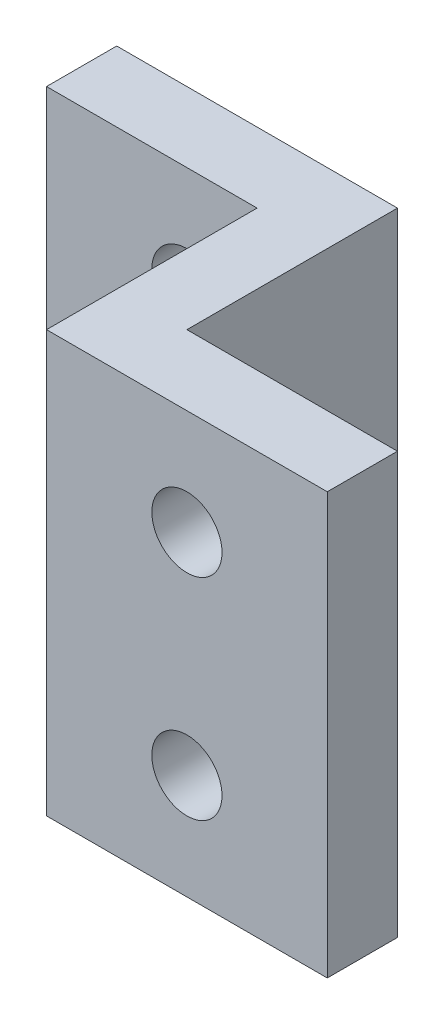
ISO-10303-21;
HEADER;
FILE_DESCRIPTION(('STEP AP214'),'2;1');
FILE_NAME('part.step','',(''),(''),'','','');
FILE_SCHEMA(('AUTOMOTIVE_DESIGN { 1 0 10303 214 1 1 1 1 }'));
ENDSEC;
DATA;
#1=APPLICATION_CONTEXT('core data for automotive mechanical design processes');
#2=APPLICATION_PROTOCOL_DEFINITION('international standard','automotive_design',2000,#1);
#3=PRODUCT_CONTEXT('',#1,'mechanical');
#4=PRODUCT('Part','Part','',(#3));
#5=PRODUCT_RELATED_PRODUCT_CATEGORY('part','',(#4));
#6=PRODUCT_DEFINITION_FORMATION('','',#4);
#7=PRODUCT_DEFINITION_CONTEXT('part definition',#1,'design');
#8=PRODUCT_DEFINITION('design','',#6,#7);
#9=PRODUCT_DEFINITION_SHAPE('','',#8);
#10=(LENGTH_UNIT() NAMED_UNIT(*) SI_UNIT(.MILLI.,.METRE.));
#11=(NAMED_UNIT(*) PLANE_ANGLE_UNIT() SI_UNIT($,.RADIAN.));
#12=(NAMED_UNIT(*) SI_UNIT($,.STERADIAN.) SOLID_ANGLE_UNIT());
#13=UNCERTAINTY_MEASURE_WITH_UNIT(LENGTH_MEASURE(1.E-05),#10,'distance_accuracy_value','');
#14=(GEOMETRIC_REPRESENTATION_CONTEXT(3) GLOBAL_UNCERTAINTY_ASSIGNED_CONTEXT((#13)) GLOBAL_UNIT_ASSIGNED_CONTEXT((#10,
#11,#12)) REPRESENTATION_CONTEXT('',''));
#15=CARTESIAN_POINT('',(0.,0.,0.));
#16=DIRECTION('',(0.,0.,1.));
#17=DIRECTION('',(1.,0.,0.));
#18=AXIS2_PLACEMENT_3D('',#15,#16,#17);
#19=CARTESIAN_POINT('',(-41.1927693778549,21.7251632935657,5.));
#20=DIRECTION('',(-1.,0.,0.));
#21=DIRECTION('',(0.,-1.,0.));
#22=AXIS2_PLACEMENT_3D('',#19,#20,#21);
#23=PLANE('',#22);
#24=DIRECTION('',(0.,0.,-1.));
#25=VECTOR('',#24,1.);
#26=CARTESIAN_POINT('',(-41.1927693778549,21.7251632935657,5.));
#27=LINE('',#26,#25);
#28=CARTESIAN_POINT('',(-41.1927693778549,21.7251632935657,5.));
#29=VERTEX_POINT('',#28);
#30=CARTESIAN_POINT('',(-41.1927693778549,21.7251632935657,-10.));
#31=VERTEX_POINT('',#30);
#32=EDGE_CURVE('E180',#29,#31,#27,.T.);
#33=ORIENTED_EDGE('',*,*,#32,.T.);
#34=DIRECTION('',(0.,-1.,0.));
#35=VECTOR('',#34,1.);
#36=CARTESIAN_POINT('',(-41.1927693778549,-8.27483670643432,-10.));
#37=LINE('',#36,#35);
#38=CARTESIAN_POINT('',(-41.1927693778549,-8.27483670643432,-10.));
#39=VERTEX_POINT('',#38);
#40=EDGE_CURVE('E158',#31,#39,#37,.T.);
#41=ORIENTED_EDGE('',*,*,#40,.T.);
#42=DIRECTION('',(0.,0.,-1.));
#43=VECTOR('',#42,1.);
#44=CARTESIAN_POINT('',(-41.1927693778549,-8.27483670643432,5.));
#45=LINE('',#44,#43);
#46=CARTESIAN_POINT('',(-41.1927693778549,-8.27483670643432,5.));
#47=VERTEX_POINT('',#46);
#48=EDGE_CURVE('E157',#47,#39,#45,.T.);
#49=ORIENTED_EDGE('',*,*,#48,.F.);
#50=DIRECTION('',(0.,1.,0.));
#51=VECTOR('',#50,1.);
#52=CARTESIAN_POINT('',(-41.1927693778549,21.7251632935657,5.));
#53=LINE('',#52,#51);
#54=EDGE_CURVE('E175',#47,#29,#53,.T.);
#55=ORIENTED_EDGE('',*,*,#54,.T.);
#56=EDGE_LOOP('',(#33,#41,#49,#55));
#57=FACE_BOUND('',#56,.T.);
#58=ADVANCED_FACE('F38',(#57),#23,.T.);
#59=CARTESIAN_POINT('',(0.,0.,5.));
#60=DIRECTION('',(0.,0.,1.));
#61=DIRECTION('',(1.,0.,0.));
#62=AXIS2_PLACEMENT_3D('',#59,#60,#61);
#63=PLANE('',#62);
#64=CARTESIAN_POINT('',(-31.1927693778549,14.2251632935657,5.));
#65=DIRECTION('',(0.,0.,1.));
#66=DIRECTION('',(1.,0.,0.));
#67=AXIS2_PLACEMENT_3D('',#64,#65,#66);
#68=CIRCLE('',#67,2.5);
#69=CARTESIAN_POINT('',(-28.6927693778549,14.2251632935657,5.));
#70=VERTEX_POINT('',#69);
#71=EDGE_CURVE('E100',#70,#70,#68,.T.);
#72=ORIENTED_EDGE('',*,*,#71,.F.);
#73=EDGE_LOOP('',(#72));
#74=FACE_BOUND('',#73,.T.);
#75=DIRECTION('',(0.,1.,0.));
#76=VECTOR('',#75,1.);
#77=CARTESIAN_POINT('',(-21.1927693778549,-8.27483670643432,5.));
#78=LINE('',#77,#76);
#79=CARTESIAN_POINT('',(-21.1927693778549,-8.27483670643432,5.));
#80=VERTEX_POINT('',#79);
#81=CARTESIAN_POINT('',(-21.1927693778549,21.7251632935657,5.));
#82=VERTEX_POINT('',#81);
#83=EDGE_CURVE('E90',#80,#82,#78,.T.);
#84=ORIENTED_EDGE('',*,*,#83,.T.);
#85=DIRECTION('',(-1.,0.,0.));
#86=VECTOR('',#85,1.);
#87=CARTESIAN_POINT('',(-21.1927693778549,21.7251632935657,5.));
#88=LINE('',#87,#86);
#89=EDGE_CURVE('E192',#82,#29,#88,.T.);
#90=ORIENTED_EDGE('',*,*,#89,.T.);
#91=ORIENTED_EDGE('',*,*,#54,.F.);
#92=DIRECTION('',(1.,0.,0.));
#93=VECTOR('',#92,1.);
#94=CARTESIAN_POINT('',(-36.1927693778549,-8.27483670643432,5.));
#95=LINE('',#94,#93);
#96=EDGE_CURVE('E62',#47,#80,#95,.T.);
#97=ORIENTED_EDGE('',*,*,#96,.T.);
#98=EDGE_LOOP('',(#84,#90,#91,#97));
#99=FACE_BOUND('',#98,.T.);
#100=CARTESIAN_POINT('',(-31.1927693778549,-0.77483670643432,5.));
#101=DIRECTION('',(0.,0.,1.));
#102=DIRECTION('',(1.,0.,0.));
#103=AXIS2_PLACEMENT_3D('',#100,#101,#102);
#104=CIRCLE('',#103,2.5);
#105=CARTESIAN_POINT('',(-28.6927693778549,-0.77483670643432,5.));
#106=VERTEX_POINT('',#105);
#107=EDGE_CURVE('E185',#106,#106,#104,.T.);
#108=ORIENTED_EDGE('',*,*,#107,.F.);
#109=EDGE_LOOP('',(#108));
#110=FACE_BOUND('',#109,.T.);
#111=ADVANCED_FACE('F194',(#74,#99,#110),#63,.T.);
#112=CARTESIAN_POINT('',(0.,0.,0.));
#113=DIRECTION('',(0.,0.,1.));
#114=DIRECTION('',(1.,0.,0.));
#115=AXIS2_PLACEMENT_3D('',#112,#113,#114);
#116=PLANE('',#115);
#117=DIRECTION('',(0.,1.,0.));
#118=VECTOR('',#117,1.);
#119=CARTESIAN_POINT('',(-21.1927693778549,-8.27483670643432,0.));
#120=LINE('',#119,#118);
#121=CARTESIAN_POINT('',(-21.1927693778549,-8.27483670643432,0.));
#122=VERTEX_POINT('',#121);
#123=CARTESIAN_POINT('',(-21.1927693778549,21.7251632935657,0.));
#124=VERTEX_POINT('',#123);
#125=EDGE_CURVE('E96',#122,#124,#120,.T.);
#126=ORIENTED_EDGE('',*,*,#125,.F.);
#127=DIRECTION('',(1.,0.,0.));
#128=VECTOR('',#127,1.);
#129=CARTESIAN_POINT('',(-36.1927693778549,-8.27483670643432,0.));
#130=LINE('',#129,#128);
#131=CARTESIAN_POINT('',(-36.1927693778549,-8.27483670643432,0.));
#132=VERTEX_POINT('',#131);
#133=EDGE_CURVE('E79',#132,#122,#130,.T.);
#134=ORIENTED_EDGE('',*,*,#133,.F.);
#135=DIRECTION('',(0.,-1.,0.));
#136=VECTOR('',#135,1.);
#137=CARTESIAN_POINT('',(-36.1927693778549,21.7251632935657,0.));
#138=LINE('',#137,#136);
#139=CARTESIAN_POINT('',(-36.1927693778549,21.7251632935657,0.));
#140=VERTEX_POINT('',#139);
#141=EDGE_CURVE('E91',#140,#132,#138,.T.);
#142=ORIENTED_EDGE('',*,*,#141,.F.);
#143=DIRECTION('',(-1.,0.,0.));
#144=VECTOR('',#143,1.);
#145=CARTESIAN_POINT('',(-21.1927693778549,21.7251632935657,0.));
#146=LINE('',#145,#144);
#147=EDGE_CURVE('E99',#124,#140,#146,.T.);
#148=ORIENTED_EDGE('',*,*,#147,.F.);
#149=EDGE_LOOP('',(#126,#134,#142,#148));
#150=FACE_BOUND('',#149,.T.);
#151=CARTESIAN_POINT('',(-31.1927693778549,14.2251632935657,0.));
#152=DIRECTION('',(0.,0.,1.));
#153=DIRECTION('',(1.,0.,0.));
#154=AXIS2_PLACEMENT_3D('',#151,#152,#153);
#155=CIRCLE('',#154,2.5);
#156=CARTESIAN_POINT('',(-28.6927693778549,14.2251632935657,0.));
#157=VERTEX_POINT('',#156);
#158=EDGE_CURVE('E104',#157,#157,#155,.T.);
#159=ORIENTED_EDGE('',*,*,#158,.T.);
#160=EDGE_LOOP('',(#159));
#161=FACE_BOUND('',#160,.T.);
#162=CARTESIAN_POINT('',(-31.1927693778549,-0.77483670643432,0.));
#163=DIRECTION('',(0.,0.,1.));
#164=DIRECTION('',(1.,0.,0.));
#165=AXIS2_PLACEMENT_3D('',#162,#163,#164);
#166=CIRCLE('',#165,2.5);
#167=CARTESIAN_POINT('',(-28.6927693778549,-0.77483670643432,0.));
#168=VERTEX_POINT('',#167);
#169=EDGE_CURVE('E179',#168,#168,#166,.T.);
#170=ORIENTED_EDGE('',*,*,#169,.T.);
#171=EDGE_LOOP('',(#170));
#172=FACE_BOUND('',#171,.T.);
#173=ADVANCED_FACE('F97',(#150,#161,#172),#116,.F.);
#174=CARTESIAN_POINT('',(-21.1927693778549,-8.27483670643432,5.));
#175=DIRECTION('',(-1.,0.,0.));
#176=DIRECTION('',(0.,-1.,0.));
#177=AXIS2_PLACEMENT_3D('',#174,#175,#176);
#178=PLANE('',#177);
#179=ORIENTED_EDGE('',*,*,#125,.T.);
#180=DIRECTION('',(0.,0.,-1.));
#181=VECTOR('',#180,1.);
#182=CARTESIAN_POINT('',(-21.1927693778549,21.7251632935657,5.));
#183=LINE('',#182,#181);
#184=EDGE_CURVE('E11',#82,#124,#183,.T.);
#185=ORIENTED_EDGE('',*,*,#184,.F.);
#186=ORIENTED_EDGE('',*,*,#83,.F.);
#187=DIRECTION('',(0.,0.,-1.));
#188=VECTOR('',#187,1.);
#189=CARTESIAN_POINT('',(-21.1927693778549,-8.27483670643432,5.));
#190=LINE('',#189,#188);
#191=EDGE_CURVE('E46',#80,#122,#190,.T.);
#192=ORIENTED_EDGE('',*,*,#191,.T.);
#193=EDGE_LOOP('',(#179,#185,#186,#192));
#194=FACE_BOUND('',#193,.T.);
#195=ADVANCED_FACE('F40',(#194),#178,.F.);
#196=CARTESIAN_POINT('',(-21.1927693778549,21.7251632935657,5.));
#197=DIRECTION('',(0.,-1.,0.));
#198=DIRECTION('',(1.,0.,0.));
#199=AXIS2_PLACEMENT_3D('',#196,#197,#198);
#200=PLANE('',#199);
#201=ORIENTED_EDGE('',*,*,#147,.T.);
#202=DIRECTION('',(0.,0.,-1.));
#203=VECTOR('',#202,1.);
#204=CARTESIAN_POINT('',(-36.1927693778549,21.7251632935657,5.));
#205=LINE('',#204,#203);
#206=CARTESIAN_POINT('',(-36.1927693778549,21.7251632935657,-15.));
#207=VERTEX_POINT('',#206);
#208=EDGE_CURVE('E115',#140,#207,#205,.T.);
#209=ORIENTED_EDGE('',*,*,#208,.T.);
#210=DIRECTION('',(1.,0.,0.));
#211=VECTOR('',#210,1.);
#212=CARTESIAN_POINT('',(-36.1927693778549,21.7251632935657,-15.));
#213=LINE('',#212,#211);
#214=CARTESIAN_POINT('',(-56.1927693778549,21.7251632935657,-15.));
#215=VERTEX_POINT('',#214);
#216=EDGE_CURVE('E172',#215,#207,#213,.T.);
#217=ORIENTED_EDGE('',*,*,#216,.F.);
#218=DIRECTION('',(0.,0.,-1.));
#219=VECTOR('',#218,1.);
#220=CARTESIAN_POINT('',(-56.1927693778549,21.7251632935657,-10.));
#221=LINE('',#220,#219);
#222=CARTESIAN_POINT('',(-56.1927693778549,21.7251632935657,-10.));
#223=VERTEX_POINT('',#222);
#224=EDGE_CURVE('E149',#223,#215,#221,.T.);
#225=ORIENTED_EDGE('',*,*,#224,.F.);
#226=DIRECTION('',(1.,0.,0.));
#227=VECTOR('',#226,1.);
#228=CARTESIAN_POINT('',(-41.1927693778549,21.7251632935657,-10.));
#229=LINE('',#228,#227);
#230=EDGE_CURVE('E150',#223,#31,#229,.T.);
#231=ORIENTED_EDGE('',*,*,#230,.T.);
#232=ORIENTED_EDGE('',*,*,#32,.F.);
#233=ORIENTED_EDGE('',*,*,#89,.F.);
#234=ORIENTED_EDGE('',*,*,#184,.T.);
#235=EDGE_LOOP('',(#201,#209,#217,#225,#231,#232,#233,#234));
#236=FACE_BOUND('',#235,.T.);
#237=ADVANCED_FACE('F197',(#236),#200,.F.);
#238=CARTESIAN_POINT('',(-36.1927693778549,-8.27483670643432,5.));
#239=DIRECTION('',(0.,1.,0.));
#240=DIRECTION('',(-1.,0.,0.));
#241=AXIS2_PLACEMENT_3D('',#238,#239,#240);
#242=PLANE('',#241);
#243=ORIENTED_EDGE('',*,*,#133,.T.);
#244=ORIENTED_EDGE('',*,*,#191,.F.);
#245=ORIENTED_EDGE('',*,*,#96,.F.);
#246=ORIENTED_EDGE('',*,*,#48,.T.);
#247=DIRECTION('',(-1.,0.,0.));
#248=VECTOR('',#247,1.);
#249=CARTESIAN_POINT('',(-41.1927693778549,-8.27483670643432,-10.));
#250=LINE('',#249,#248);
#251=CARTESIAN_POINT('',(-56.1927693778549,-8.27483670643432,-10.));
#252=VERTEX_POINT('',#251);
#253=EDGE_CURVE('E53',#39,#252,#250,.T.);
#254=ORIENTED_EDGE('',*,*,#253,.T.);
#255=DIRECTION('',(0.,0.,-1.));
#256=VECTOR('',#255,1.);
#257=CARTESIAN_POINT('',(-56.1927693778549,-8.27483670643432,-10.));
#258=LINE('',#257,#256);
#259=CARTESIAN_POINT('',(-56.1927693778549,-8.27483670643432,-15.));
#260=VERTEX_POINT('',#259);
#261=EDGE_CURVE('E142',#252,#260,#258,.T.);
#262=ORIENTED_EDGE('',*,*,#261,.T.);
#263=DIRECTION('',(-1.,0.,0.));
#264=VECTOR('',#263,1.);
#265=CARTESIAN_POINT('',(-36.1927693778549,-8.27483670643432,-15.));
#266=LINE('',#265,#264);
#267=CARTESIAN_POINT('',(-36.1927693778549,-8.27483670643432,-15.));
#268=VERTEX_POINT('',#267);
#269=EDGE_CURVE('E170',#268,#260,#266,.T.);
#270=ORIENTED_EDGE('',*,*,#269,.F.);
#271=DIRECTION('',(0.,0.,-1.));
#272=VECTOR('',#271,1.);
#273=CARTESIAN_POINT('',(-36.1927693778549,-8.27483670643432,5.));
#274=LINE('',#273,#272);
#275=EDGE_CURVE('E85',#132,#268,#274,.T.);
#276=ORIENTED_EDGE('',*,*,#275,.F.);
#277=EDGE_LOOP('',(#243,#244,#245,#246,#254,#262,#270,#276));
#278=FACE_BOUND('',#277,.T.);
#279=ADVANCED_FACE('F81',(#278),#242,.F.);
#280=CARTESIAN_POINT('',(-31.1927693778549,14.2251632935657,5.));
#281=DIRECTION('',(0.,0.,-1.));
#282=DIRECTION('',(-1.,0.,0.));
#283=AXIS2_PLACEMENT_3D('',#280,#281,#282);
#284=CYLINDRICAL_SURFACE('',#283,2.5);
#285=ORIENTED_EDGE('',*,*,#71,.T.);
#286=EDGE_LOOP('',(#285));
#287=FACE_BOUND('',#286,.T.);
#288=ORIENTED_EDGE('',*,*,#158,.F.);
#289=EDGE_LOOP('',(#288));
#290=FACE_BOUND('',#289,.T.);
#291=ADVANCED_FACE('F215',(#287,#290),#284,.F.);
#292=CARTESIAN_POINT('',(-31.1927693778549,-0.77483670643432,5.));
#293=DIRECTION('',(0.,0.,-1.));
#294=DIRECTION('',(-1.,0.,0.));
#295=AXIS2_PLACEMENT_3D('',#292,#293,#294);
#296=CYLINDRICAL_SURFACE('',#295,2.5);
#297=ORIENTED_EDGE('',*,*,#107,.T.);
#298=EDGE_LOOP('',(#297));
#299=FACE_BOUND('',#298,.T.);
#300=ORIENTED_EDGE('',*,*,#169,.F.);
#301=EDGE_LOOP('',(#300));
#302=FACE_BOUND('',#301,.T.);
#303=ADVANCED_FACE('F212',(#299,#302),#296,.F.);
#304=CARTESIAN_POINT('',(-36.1927693778549,21.7251632935657,5.));
#305=DIRECTION('',(1.,0.,0.));
#306=DIRECTION('',(0.,1.,0.));
#307=AXIS2_PLACEMENT_3D('',#304,#305,#306);
#308=PLANE('',#307);
#309=ORIENTED_EDGE('',*,*,#208,.F.);
#310=ORIENTED_EDGE('',*,*,#141,.T.);
#311=ORIENTED_EDGE('',*,*,#275,.T.);
#312=DIRECTION('',(0.,-1.,0.));
#313=VECTOR('',#312,1.);
#314=CARTESIAN_POINT('',(-36.1927693778549,21.7251632935657,-15.));
#315=LINE('',#314,#313);
#316=EDGE_CURVE('E166',#207,#268,#315,.T.);
#317=ORIENTED_EDGE('',*,*,#316,.F.);
#318=EDGE_LOOP('',(#309,#310,#311,#317));
#319=FACE_BOUND('',#318,.T.);
#320=ADVANCED_FACE('F111',(#319),#308,.T.);
#321=CARTESIAN_POINT('',(0.,0.,-15.));
#322=DIRECTION('',(0.,0.,-1.));
#323=DIRECTION('',(-1.,0.,0.));
#324=AXIS2_PLACEMENT_3D('',#321,#322,#323);
#325=PLANE('',#324);
#326=CARTESIAN_POINT('',(-46.1927693778549,14.2251632935657,-15.));
#327=DIRECTION('',(0.,0.,-1.));
#328=DIRECTION('',(-1.,0.,0.));
#329=AXIS2_PLACEMENT_3D('',#326,#327,#328);
#330=CIRCLE('',#329,2.5);
#331=CARTESIAN_POINT('',(-48.6927693778549,14.2251632935657,-15.));
#332=VERTEX_POINT('',#331);
#333=EDGE_CURVE('E165',#332,#332,#330,.T.);
#334=ORIENTED_EDGE('',*,*,#333,.F.);
#335=EDGE_LOOP('',(#334));
#336=FACE_BOUND('',#335,.T.);
#337=CARTESIAN_POINT('',(-46.1927693778549,-0.774836706434322,-15.));
#338=DIRECTION('',(0.,0.,-1.));
#339=DIRECTION('',(-1.,0.,0.));
#340=AXIS2_PLACEMENT_3D('',#337,#338,#339);
#341=CIRCLE('',#340,2.5);
#342=CARTESIAN_POINT('',(-48.6927693778549,-0.774836706434322,-15.));
#343=VERTEX_POINT('',#342);
#344=EDGE_CURVE('E317',#343,#343,#341,.T.);
#345=ORIENTED_EDGE('',*,*,#344,.F.);
#346=EDGE_LOOP('',(#345));
#347=FACE_BOUND('',#346,.T.);
#348=ORIENTED_EDGE('',*,*,#316,.T.);
#349=ORIENTED_EDGE('',*,*,#269,.T.);
#350=DIRECTION('',(0.,1.,0.));
#351=VECTOR('',#350,1.);
#352=CARTESIAN_POINT('',(-56.1927693778549,-8.27483670643432,-15.));
#353=LINE('',#352,#351);
#354=EDGE_CURVE('E148',#260,#215,#353,.T.);
#355=ORIENTED_EDGE('',*,*,#354,.T.);
#356=ORIENTED_EDGE('',*,*,#216,.T.);
#357=EDGE_LOOP('',(#348,#349,#355,#356));
#358=FACE_BOUND('',#357,.T.);
#359=ADVANCED_FACE('F208',(#336,#347,#358),#325,.T.);
#360=CARTESIAN_POINT('',(-56.1927693778549,-8.27483670643432,-10.));
#361=DIRECTION('',(-1.,0.,0.));
#362=DIRECTION('',(0.,0.,1.));
#363=AXIS2_PLACEMENT_3D('',#360,#361,#362);
#364=PLANE('',#363);
#365=ORIENTED_EDGE('',*,*,#354,.F.);
#366=ORIENTED_EDGE('',*,*,#261,.F.);
#367=DIRECTION('',(0.,1.,0.));
#368=VECTOR('',#367,1.);
#369=CARTESIAN_POINT('',(-56.1927693778549,-8.27483670643432,-10.));
#370=LINE('',#369,#368);
#371=EDGE_CURVE('E145',#252,#223,#370,.T.);
#372=ORIENTED_EDGE('',*,*,#371,.T.);
#373=ORIENTED_EDGE('',*,*,#224,.T.);
#374=EDGE_LOOP('',(#365,#366,#372,#373));
#375=FACE_BOUND('',#374,.T.);
#376=ADVANCED_FACE('F143',(#375),#364,.T.);
#377=CARTESIAN_POINT('',(0.,0.,-10.));
#378=DIRECTION('',(0.,0.,1.));
#379=DIRECTION('',(1.,0.,0.));
#380=AXIS2_PLACEMENT_3D('',#377,#378,#379);
#381=PLANE('',#380);
#382=CARTESIAN_POINT('',(-46.1927693778549,14.2251632935657,-10.));
#383=DIRECTION('',(0.,0.,1.));
#384=DIRECTION('',(1.,0.,0.));
#385=AXIS2_PLACEMENT_3D('',#382,#383,#384);
#386=CIRCLE('',#385,2.5);
#387=CARTESIAN_POINT('',(-43.6927693778549,14.2251632935657,-10.));
#388=VERTEX_POINT('',#387);
#389=EDGE_CURVE('E316',#388,#388,#386,.T.);
#390=ORIENTED_EDGE('',*,*,#389,.F.);
#391=EDGE_LOOP('',(#390));
#392=FACE_BOUND('',#391,.T.);
#393=CARTESIAN_POINT('',(-46.1927693778549,-0.774836706434322,-10.));
#394=DIRECTION('',(0.,0.,1.));
#395=DIRECTION('',(1.,0.,0.));
#396=AXIS2_PLACEMENT_3D('',#393,#394,#395);
#397=CIRCLE('',#396,2.5);
#398=CARTESIAN_POINT('',(-43.6927693778549,-0.774836706434322,-10.));
#399=VERTEX_POINT('',#398);
#400=EDGE_CURVE('E318',#399,#399,#397,.T.);
#401=ORIENTED_EDGE('',*,*,#400,.F.);
#402=EDGE_LOOP('',(#401));
#403=FACE_BOUND('',#402,.T.);
#404=ORIENTED_EDGE('',*,*,#40,.F.);
#405=ORIENTED_EDGE('',*,*,#230,.F.);
#406=ORIENTED_EDGE('',*,*,#371,.F.);
#407=ORIENTED_EDGE('',*,*,#253,.F.);
#408=EDGE_LOOP('',(#404,#405,#406,#407));
#409=FACE_BOUND('',#408,.T.);
#410=ADVANCED_FACE('F152',(#392,#403,#409),#381,.T.);
#411=CARTESIAN_POINT('',(-46.1927693778549,-0.774836706434322,-20.));
#412=DIRECTION('',(0.,0.,1.));
#413=DIRECTION('',(1.,0.,0.));
#414=AXIS2_PLACEMENT_3D('',#411,#412,#413);
#415=CYLINDRICAL_SURFACE('',#414,2.5);
#416=ORIENTED_EDGE('',*,*,#344,.T.);
#417=EDGE_LOOP('',(#416));
#418=FACE_BOUND('',#417,.T.);
#419=ORIENTED_EDGE('',*,*,#400,.T.);
#420=EDGE_LOOP('',(#419));
#421=FACE_BOUND('',#420,.T.);
#422=ADVANCED_FACE('F287',(#418,#421),#415,.F.);
#423=CARTESIAN_POINT('',(-46.1927693778549,14.2251632935657,-20.));
#424=DIRECTION('',(0.,0.,1.));
#425=DIRECTION('',(1.,0.,0.));
#426=AXIS2_PLACEMENT_3D('',#423,#424,#425);
#427=CYLINDRICAL_SURFACE('',#426,2.5);
#428=ORIENTED_EDGE('',*,*,#333,.T.);
#429=EDGE_LOOP('',(#428));
#430=FACE_BOUND('',#429,.T.);
#431=ORIENTED_EDGE('',*,*,#389,.T.);
#432=EDGE_LOOP('',(#431));
#433=FACE_BOUND('',#432,.T.);
#434=ADVANCED_FACE('F297',(#430,#433),#427,.F.);
#435=CLOSED_SHELL('',(#58,#111,#173,#195,#237,#279,#291,#303,#320,#359,#376,#410,#422,#434));
#436=MANIFOLD_SOLID_BREP('B2',#435);
#437=ADVANCED_BREP_SHAPE_REPRESENTATION('',(#18,#436),#14);
#438=SHAPE_DEFINITION_REPRESENTATION(#9,#437);
ENDSEC;
END-ISO-10303-21;
